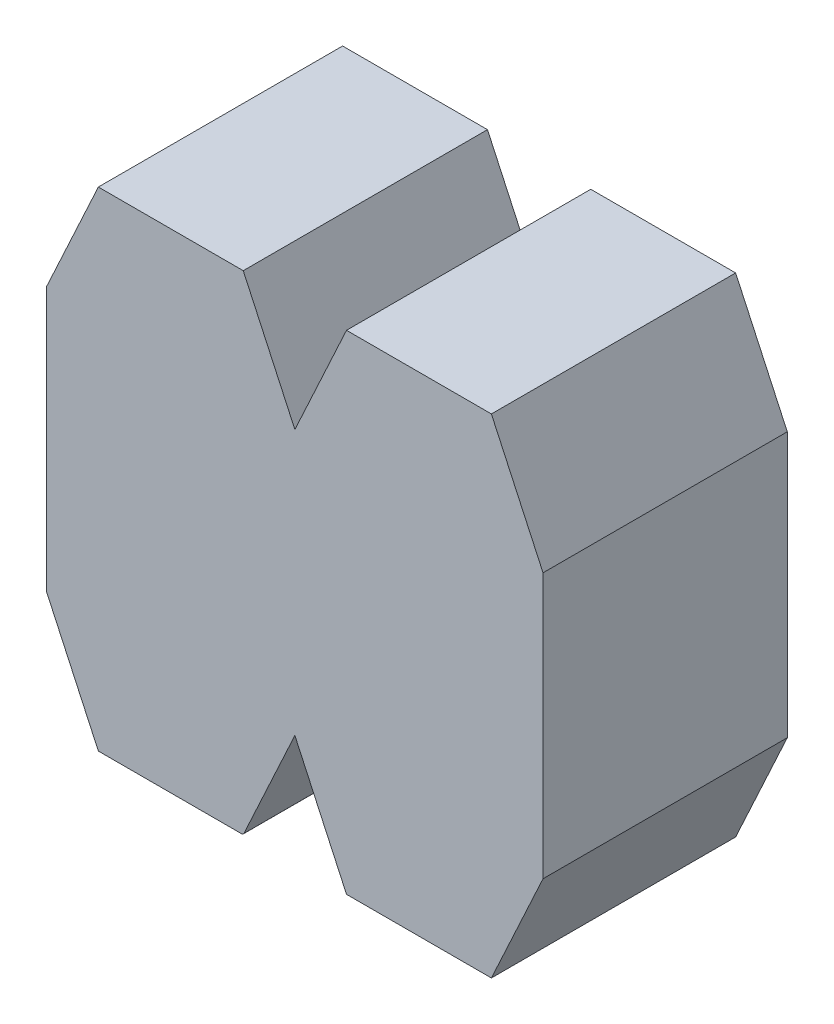
ISO-10303-21;
HEADER;
FILE_DESCRIPTION(('STEP AP214'),'2;1');
FILE_NAME('part.step','',(''),(''),'','','');
FILE_SCHEMA(('AUTOMOTIVE_DESIGN { 1 0 10303 214 1 1 1 1 }'));
ENDSEC;
DATA;
#1=APPLICATION_CONTEXT('core data for automotive mechanical design processes');
#2=APPLICATION_PROTOCOL_DEFINITION('international standard','automotive_design',2000,#1);
#3=PRODUCT_CONTEXT('',#1,'mechanical');
#4=PRODUCT('Part','Part','',(#3));
#5=PRODUCT_RELATED_PRODUCT_CATEGORY('part','',(#4));
#6=PRODUCT_DEFINITION_FORMATION('','',#4);
#7=PRODUCT_DEFINITION_CONTEXT('part definition',#1,'design');
#8=PRODUCT_DEFINITION('design','',#6,#7);
#9=PRODUCT_DEFINITION_SHAPE('','',#8);
#10=(LENGTH_UNIT() NAMED_UNIT(*) SI_UNIT(.MILLI.,.METRE.));
#11=(NAMED_UNIT(*) PLANE_ANGLE_UNIT() SI_UNIT($,.RADIAN.));
#12=(NAMED_UNIT(*) SI_UNIT($,.STERADIAN.) SOLID_ANGLE_UNIT());
#13=UNCERTAINTY_MEASURE_WITH_UNIT(LENGTH_MEASURE(1.E-05),#10,'distance_accuracy_value','');
#14=(GEOMETRIC_REPRESENTATION_CONTEXT(3) GLOBAL_UNCERTAINTY_ASSIGNED_CONTEXT((#13)) GLOBAL_UNIT_ASSIGNED_CONTEXT((#10,
#11,#12)) REPRESENTATION_CONTEXT('',''));
#15=CARTESIAN_POINT('',(0.,0.,0.));
#16=DIRECTION('',(0.,0.,1.));
#17=DIRECTION('',(1.,0.,0.));
#18=AXIS2_PLACEMENT_3D('',#15,#16,#17);
#19=CARTESIAN_POINT('',(-36.2577679754678,28.2576441948346,0.99));
#20=DIRECTION('',(0.907799905305119,0.419403543056108,0.));
#21=DIRECTION('',(-0.419403543056108,0.907799905305119,0.));
#22=AXIS2_PLACEMENT_3D('',#19,#20,#21);
#23=PLANE('',#22);
#24=DIRECTION('',(-0.419403543056108,0.907799905305119,0.));
#25=VECTOR('',#24,1.);
#26=CARTESIAN_POINT('',(-36.2577679754678,28.2576441948346,3.5));
#27=LINE('',#26,#25);
#28=CARTESIAN_POINT('',(-36.7904883959929,29.4107187344124,3.5));
#29=VERTEX_POINT('',#28);
#30=CARTESIAN_POINT('',(-36.2619620108984,28.2667221938878,3.5));
#31=VERTEX_POINT('',#30);
#32=EDGE_CURVE('E118',#29,#31,#27,.F.);
#33=ORIENTED_EDGE('',*,*,#32,.T.);
#34=DIRECTION('',(0.,0.,-1.));
#35=VECTOR('',#34,1.);
#36=CARTESIAN_POINT('',(-36.2619620108984,28.2667221938877,2.25));
#37=LINE('',#36,#35);
#38=CARTESIAN_POINT('',(-36.2619620108984,28.2667221938877,1.));
#39=VERTEX_POINT('',#38);
#40=EDGE_CURVE('E244',#31,#39,#37,.T.);
#41=ORIENTED_EDGE('',*,*,#40,.T.);
#42=DIRECTION('',(-0.419403543056108,0.907799905305119,0.));
#43=VECTOR('',#42,1.);
#44=CARTESIAN_POINT('',(-36.2577679754678,28.2576441948346,1.));
#45=LINE('',#44,#43);
#46=CARTESIAN_POINT('',(-36.7904883959929,29.4107187344124,1.));
#47=VERTEX_POINT('',#46);
#48=EDGE_CURVE('E42',#39,#47,#45,.T.);
#49=ORIENTED_EDGE('',*,*,#48,.T.);
#50=DIRECTION('',(0.,0.,-1.));
#51=VECTOR('',#50,1.);
#52=CARTESIAN_POINT('',(-36.7904883959929,29.4107187344124,2.25));
#53=LINE('',#52,#51);
#54=EDGE_CURVE('E238',#29,#47,#53,.T.);
#55=ORIENTED_EDGE('',*,*,#54,.F.);
#56=EDGE_LOOP('',(#33,#41,#49,#55));
#57=FACE_BOUND('',#56,.T.);
#58=ADVANCED_FACE('F38',(#57),#23,.T.);
#59=CARTESIAN_POINT('',(-36.7804883959929,29.4107187344124,0.99));
#60=DIRECTION('',(0.,1.,0.));
#61=DIRECTION('',(-1.,0.,0.));
#62=AXIS2_PLACEMENT_3D('',#59,#60,#61);
#63=PLANE('',#62);
#64=DIRECTION('',(-1.,0.,0.));
#65=VECTOR('',#64,1.);
#66=CARTESIAN_POINT('',(-36.7804883959929,29.4107187344124,3.5));
#67=LINE('',#66,#65);
#68=CARTESIAN_POINT('',(-38.273435625804,29.4107187344124,3.5));
#69=VERTEX_POINT('',#68);
#70=EDGE_CURVE('E239',#69,#29,#67,.F.);
#71=ORIENTED_EDGE('',*,*,#70,.T.);
#72=ORIENTED_EDGE('',*,*,#54,.T.);
#73=DIRECTION('',(-1.,0.,0.));
#74=VECTOR('',#73,1.);
#75=CARTESIAN_POINT('',(-36.7804883959929,29.4107187344124,1.));
#76=LINE('',#75,#74);
#77=CARTESIAN_POINT('',(-38.273435625804,29.4107187344124,1.));
#78=VERTEX_POINT('',#77);
#79=EDGE_CURVE('E125',#47,#78,#76,.T.);
#80=ORIENTED_EDGE('',*,*,#79,.T.);
#81=DIRECTION('',(0.,0.,-1.));
#82=VECTOR('',#81,1.);
#83=CARTESIAN_POINT('',(-38.273435625804,29.4107187344124,2.25));
#84=LINE('',#83,#82);
#85=EDGE_CURVE('E229',#69,#78,#84,.T.);
#86=ORIENTED_EDGE('',*,*,#85,.F.);
#87=EDGE_LOOP('',(#71,#72,#80,#86));
#88=FACE_BOUND('',#87,.T.);
#89=ADVANCED_FACE('F334',(#88),#63,.T.);
#90=CARTESIAN_POINT('',(-38.2692415903734,29.4197967334655,0.99));
#91=DIRECTION('',(-0.907799905305117,0.419403543056113,0.));
#92=DIRECTION('',(-0.419403543056113,-0.907799905305117,0.));
#93=AXIS2_PLACEMENT_3D('',#90,#91,#92);
#94=PLANE('',#93);
#95=DIRECTION('',(-0.419403543056113,-0.907799905305117,0.));
#96=VECTOR('',#95,1.);
#97=CARTESIAN_POINT('',(-38.2692415903734,29.4197967334655,3.5));
#98=LINE('',#97,#96);
#99=CARTESIAN_POINT('',(-38.8019620108984,28.2667221938877,3.5));
#100=VERTEX_POINT('',#99);
#101=EDGE_CURVE('E230',#100,#69,#98,.F.);
#102=ORIENTED_EDGE('',*,*,#101,.T.);
#103=ORIENTED_EDGE('',*,*,#85,.T.);
#104=DIRECTION('',(-0.419403543056113,-0.907799905305117,0.));
#105=VECTOR('',#104,1.);
#106=CARTESIAN_POINT('',(-38.2692415903734,29.4197967334655,1.));
#107=LINE('',#106,#105);
#108=CARTESIAN_POINT('',(-38.8019620108984,28.2667221938877,1.));
#109=VERTEX_POINT('',#108);
#110=EDGE_CURVE('E234',#78,#109,#107,.T.);
#111=ORIENTED_EDGE('',*,*,#110,.T.);
#112=DIRECTION('',(0.,0.,-1.));
#113=VECTOR('',#112,1.);
#114=CARTESIAN_POINT('',(-38.8019620108984,28.2667221938877,2.25));
#115=LINE('',#114,#113);
#116=EDGE_CURVE('E225',#100,#109,#115,.T.);
#117=ORIENTED_EDGE('',*,*,#116,.F.);
#118=EDGE_LOOP('',(#102,#103,#111,#117));
#119=FACE_BOUND('',#118,.T.);
#120=ADVANCED_FACE('F339',(#119),#94,.T.);
#121=CARTESIAN_POINT('',(-38.7977679754678,28.2576441948346,0.99));
#122=DIRECTION('',(0.907799905305125,0.419403543056095,0.));
#123=DIRECTION('',(-0.419403543056095,0.907799905305125,0.));
#124=AXIS2_PLACEMENT_3D('',#121,#122,#123);
#125=PLANE('',#124);
#126=DIRECTION('',(-0.419403543056095,0.907799905305125,0.));
#127=VECTOR('',#126,1.);
#128=CARTESIAN_POINT('',(-38.7977679754678,28.2576441948346,3.5));
#129=LINE('',#128,#127);
#130=CARTESIAN_POINT('',(-39.3304883959928,29.4107187344124,3.5));
#131=VERTEX_POINT('',#130);
#132=EDGE_CURVE('E221',#131,#100,#129,.F.);
#133=ORIENTED_EDGE('',*,*,#132,.T.);
#134=ORIENTED_EDGE('',*,*,#116,.T.);
#135=DIRECTION('',(-0.419403543056095,0.907799905305125,0.));
#136=VECTOR('',#135,1.);
#137=CARTESIAN_POINT('',(-38.7977679754678,28.2576441948346,1.));
#138=LINE('',#137,#136);
#139=CARTESIAN_POINT('',(-39.3304883959928,29.4107187344124,1.));
#140=VERTEX_POINT('',#139);
#141=EDGE_CURVE('E226',#109,#140,#138,.T.);
#142=ORIENTED_EDGE('',*,*,#141,.T.);
#143=DIRECTION('',(0.,0.,-1.));
#144=VECTOR('',#143,1.);
#145=CARTESIAN_POINT('',(-39.3304883959929,29.4107187344124,2.25));
#146=LINE('',#145,#144);
#147=EDGE_CURVE('E220',#131,#140,#146,.T.);
#148=ORIENTED_EDGE('',*,*,#147,.F.);
#149=EDGE_LOOP('',(#133,#134,#142,#148));
#150=FACE_BOUND('',#149,.T.);
#151=ADVANCED_FACE('F377',(#150),#125,.T.);
#152=CARTESIAN_POINT('',(-39.3204883959929,29.4107187344124,0.99));
#153=DIRECTION('',(0.,1.,0.));
#154=DIRECTION('',(-1.,0.,0.));
#155=AXIS2_PLACEMENT_3D('',#152,#153,#154);
#156=PLANE('',#155);
#157=DIRECTION('',(1.,0.,0.));
#158=VECTOR('',#157,1.);
#159=CARTESIAN_POINT('',(-41.3519620108984,29.4107187344124,3.5));
#160=LINE('',#159,#158);
#161=CARTESIAN_POINT('',(-40.813435625804,29.4107187344124,3.5));
#162=VERTEX_POINT('',#161);
#163=EDGE_CURVE('E187',#131,#162,#160,.F.);
#164=ORIENTED_EDGE('',*,*,#163,.F.);
#165=ORIENTED_EDGE('',*,*,#147,.T.);
#166=DIRECTION('',(-1.,0.,0.));
#167=VECTOR('',#166,1.);
#168=CARTESIAN_POINT('',(9.4680379891016,29.4107187344124,1.));
#169=LINE('',#168,#167);
#170=CARTESIAN_POINT('',(-40.813435625804,29.4107187344124,1.));
#171=VERTEX_POINT('',#170);
#172=EDGE_CURVE('E193',#171,#140,#169,.F.);
#173=ORIENTED_EDGE('',*,*,#172,.F.);
#174=DIRECTION('',(0.,0.,-1.));
#175=VECTOR('',#174,1.);
#176=CARTESIAN_POINT('',(-40.813435625804,29.4107187344124,2.25));
#177=LINE('',#176,#175);
#178=EDGE_CURVE('E268',#162,#171,#177,.T.);
#179=ORIENTED_EDGE('',*,*,#178,.F.);
#180=EDGE_LOOP('',(#164,#165,#173,#179));
#181=FACE_BOUND('',#180,.T.);
#182=ADVANCED_FACE('F374',(#181),#156,.T.);
#183=CARTESIAN_POINT('',(9.4680379891016,24.4007187344124,1.));
#184=DIRECTION('',(0.,0.,-1.));
#185=DIRECTION('',(-1.,0.,0.));
#186=AXIS2_PLACEMENT_3D('',#183,#184,#185);
#187=PLANE('',#186);
#188=DIRECTION('',(0.,-1.,0.));
#189=VECTOR('',#188,1.);
#190=CARTESIAN_POINT('',(-36.2619620108984,25.5547152749371,1.));
#191=LINE('',#190,#189);
#192=CARTESIAN_POINT('',(-36.2619620108984,25.5547152749371,1.));
#193=VERTEX_POINT('',#192);
#194=EDGE_CURVE('E252',#39,#193,#191,.T.);
#195=ORIENTED_EDGE('',*,*,#194,.T.);
#196=DIRECTION('',(-0.419403543056138,-0.907799905305105,0.));
#197=VECTOR('',#196,1.);
#198=CARTESIAN_POINT('',(-36.2619620108983,25.5547152749371,1.));
#199=LINE('',#198,#197);
#200=CARTESIAN_POINT('',(-36.7904883959929,24.4107187344124,1.));
#201=VERTEX_POINT('',#200);
#202=EDGE_CURVE('E216',#193,#201,#199,.T.);
#203=ORIENTED_EDGE('',*,*,#202,.T.);
#204=DIRECTION('',(-1.,0.,0.));
#205=VECTOR('',#204,1.);
#206=CARTESIAN_POINT('',(9.4680379891016,24.4107187344124,1.));
#207=LINE('',#206,#205);
#208=CARTESIAN_POINT('',(-38.2734356258039,24.4107187344124,1.));
#209=VERTEX_POINT('',#208);
#210=EDGE_CURVE('E212',#201,#209,#207,.T.);
#211=ORIENTED_EDGE('',*,*,#210,.T.);
#212=DIRECTION('',(-0.419403543056137,0.907799905305106,0.));
#213=VECTOR('',#212,1.);
#214=CARTESIAN_POINT('',(-38.2734356258039,24.4107187344124,1.));
#215=LINE('',#214,#213);
#216=CARTESIAN_POINT('',(-38.8019620108984,25.5547152749371,1.));
#217=VERTEX_POINT('',#216);
#218=EDGE_CURVE('E208',#209,#217,#215,.T.);
#219=ORIENTED_EDGE('',*,*,#218,.T.);
#220=DIRECTION('',(-0.419403543056157,-0.907799905305096,0.));
#221=VECTOR('',#220,1.);
#222=CARTESIAN_POINT('',(-38.8019620108984,25.5547152749372,1.));
#223=LINE('',#222,#221);
#224=CARTESIAN_POINT('',(-39.3241616420611,24.4244130074228,1.));
#225=VERTEX_POINT('',#224);
#226=EDGE_CURVE('E204',#217,#225,#223,.T.);
#227=ORIENTED_EDGE('',*,*,#226,.T.);
#228=CARTESIAN_POINT('',(-39.1867746556714,24.2790692281209,1.));
#229=DIRECTION('',(0.,0.,-1.));
#230=DIRECTION('',(-1.,0.,0.));
#231=AXIS2_PLACEMENT_3D('',#228,#229,#230);
#232=CIRCLE('',#231,0.199999995527509);
#233=CARTESIAN_POINT('',(-39.3373349615432,24.4107187344124,1.));
#234=VERTEX_POINT('',#233);
#235=EDGE_CURVE('E201',#225,#234,#232,.F.);
#236=ORIENTED_EDGE('',*,*,#235,.T.);
#237=DIRECTION('',(-1.,0.,0.));
#238=VECTOR('',#237,1.);
#239=CARTESIAN_POINT('',(9.4680379891016,24.4107187344124,1.));
#240=LINE('',#239,#238);
#241=CARTESIAN_POINT('',(-40.8134356258039,24.4107187344124,1.));
#242=VERTEX_POINT('',#241);
#243=EDGE_CURVE('E177',#234,#242,#240,.T.);
#244=ORIENTED_EDGE('',*,*,#243,.T.);
#245=DIRECTION('',(-0.419403543056141,0.907799905305104,0.));
#246=VECTOR('',#245,1.);
#247=CARTESIAN_POINT('',(-40.8134356258039,24.4107187344124,1.));
#248=LINE('',#247,#246);
#249=CARTESIAN_POINT('',(-41.3419620108984,25.5547152749371,1.));
#250=VERTEX_POINT('',#249);
#251=EDGE_CURVE('E197',#242,#250,#248,.T.);
#252=ORIENTED_EDGE('',*,*,#251,.T.);
#253=DIRECTION('',(0.,-1.,0.));
#254=VECTOR('',#253,1.);
#255=CARTESIAN_POINT('',(-41.3419620108984,28.2767221938877,1.));
#256=LINE('',#255,#254);
#257=CARTESIAN_POINT('',(-41.3419620108984,28.2667221938877,1.));
#258=VERTEX_POINT('',#257);
#259=EDGE_CURVE('E271',#258,#250,#256,.T.);
#260=ORIENTED_EDGE('',*,*,#259,.F.);
#261=DIRECTION('',(-0.419403543056113,-0.907799905305117,0.));
#262=VECTOR('',#261,1.);
#263=CARTESIAN_POINT('',(-40.8092415903734,29.4197967334655,1.));
#264=LINE('',#263,#262);
#265=EDGE_CURVE('E307',#171,#258,#264,.T.);
#266=ORIENTED_EDGE('',*,*,#265,.F.);
#267=ORIENTED_EDGE('',*,*,#172,.T.);
#268=ORIENTED_EDGE('',*,*,#141,.F.);
#269=ORIENTED_EDGE('',*,*,#110,.F.);
#270=ORIENTED_EDGE('',*,*,#79,.F.);
#271=ORIENTED_EDGE('',*,*,#48,.F.);
#272=EDGE_LOOP('',(#195,#203,#211,#219,#227,#236,#244,#252,#260,#266,#267,#268,#269,#270,#271));
#273=FACE_BOUND('',#272,.T.);
#274=ADVANCED_FACE('F326',(#273),#187,.T.);
#275=CARTESIAN_POINT('',(-41.3519620108984,24.4007187344124,3.5));
#276=DIRECTION('',(0.,0.,1.));
#277=DIRECTION('',(1.,0.,0.));
#278=AXIS2_PLACEMENT_3D('',#275,#276,#277);
#279=PLANE('',#278);
#280=DIRECTION('',(0.,-1.,0.));
#281=VECTOR('',#280,1.);
#282=CARTESIAN_POINT('',(-36.2619620108984,25.5547152749371,3.5));
#283=LINE('',#282,#281);
#284=CARTESIAN_POINT('',(-36.2619620108984,25.5547152749371,3.5));
#285=VERTEX_POINT('',#284);
#286=EDGE_CURVE('E255',#31,#285,#283,.T.);
#287=ORIENTED_EDGE('',*,*,#286,.F.);
#288=ORIENTED_EDGE('',*,*,#32,.F.);
#289=ORIENTED_EDGE('',*,*,#70,.F.);
#290=ORIENTED_EDGE('',*,*,#101,.F.);
#291=ORIENTED_EDGE('',*,*,#132,.F.);
#292=ORIENTED_EDGE('',*,*,#163,.T.);
#293=DIRECTION('',(-0.419403543056113,-0.907799905305117,0.));
#294=VECTOR('',#293,1.);
#295=CARTESIAN_POINT('',(-40.8092415903734,29.4197967334655,3.5));
#296=LINE('',#295,#294);
#297=CARTESIAN_POINT('',(-41.3419620108984,28.2667221938877,3.5));
#298=VERTEX_POINT('',#297);
#299=EDGE_CURVE('E272',#298,#162,#296,.F.);
#300=ORIENTED_EDGE('',*,*,#299,.F.);
#301=DIRECTION('',(0.,-1.,0.));
#302=VECTOR('',#301,1.);
#303=CARTESIAN_POINT('',(-41.3419620108984,28.2767221938877,3.5));
#304=LINE('',#303,#302);
#305=CARTESIAN_POINT('',(-41.3419620108984,25.5547152749371,3.5));
#306=VERTEX_POINT('',#305);
#307=EDGE_CURVE('E267',#306,#298,#304,.F.);
#308=ORIENTED_EDGE('',*,*,#307,.F.);
#309=DIRECTION('',(0.419403543056147,-0.907799905305101,0.));
#310=VECTOR('',#309,1.);
#311=CARTESIAN_POINT('',(-41.3419620108985,25.5547152749372,3.5));
#312=LINE('',#311,#310);
#313=CARTESIAN_POINT('',(-40.8134356258039,24.4107187344124,3.5));
#314=VERTEX_POINT('',#313);
#315=EDGE_CURVE('E58',#306,#314,#312,.T.);
#316=ORIENTED_EDGE('',*,*,#315,.T.);
#317=DIRECTION('',(1.,0.,0.));
#318=VECTOR('',#317,1.);
#319=CARTESIAN_POINT('',(-41.3519620108984,24.4107187344124,3.5));
#320=LINE('',#319,#318);
#321=CARTESIAN_POINT('',(-39.3373349615432,24.4107187344124,3.5));
#322=VERTEX_POINT('',#321);
#323=EDGE_CURVE('E171',#314,#322,#320,.T.);
#324=ORIENTED_EDGE('',*,*,#323,.T.);
#325=CARTESIAN_POINT('',(-39.1867746556714,24.2790692281209,3.5));
#326=DIRECTION('',(0.,0.,1.));
#327=DIRECTION('',(1.,0.,0.));
#328=AXIS2_PLACEMENT_3D('',#325,#326,#327);
#329=CIRCLE('',#328,0.199999995527509);
#330=CARTESIAN_POINT('',(-39.3241616420611,24.4244130074228,3.5));
#331=VERTEX_POINT('',#330);
#332=EDGE_CURVE('E163',#322,#331,#329,.F.);
#333=ORIENTED_EDGE('',*,*,#332,.T.);
#334=DIRECTION('',(0.419403543056149,0.9077999053051,0.));
#335=VECTOR('',#334,1.);
#336=CARTESIAN_POINT('',(-39.3241616420611,24.4244130074228,3.5));
#337=LINE('',#336,#335);
#338=CARTESIAN_POINT('',(-38.8019620108984,25.5547152749371,3.5));
#339=VERTEX_POINT('',#338);
#340=EDGE_CURVE('E157',#331,#339,#337,.T.);
#341=ORIENTED_EDGE('',*,*,#340,.T.);
#342=DIRECTION('',(0.419403543056143,-0.907799905305103,0.));
#343=VECTOR('',#342,1.);
#344=CARTESIAN_POINT('',(-38.8019620108984,25.5547152749371,3.5));
#345=LINE('',#344,#343);
#346=CARTESIAN_POINT('',(-38.2734356258039,24.4107187344124,3.5));
#347=VERTEX_POINT('',#346);
#348=EDGE_CURVE('E319',#339,#347,#345,.T.);
#349=ORIENTED_EDGE('',*,*,#348,.T.);
#350=DIRECTION('',(1.,0.,0.));
#351=VECTOR('',#350,1.);
#352=CARTESIAN_POINT('',(-41.3519620108984,24.4107187344124,3.5));
#353=LINE('',#352,#351);
#354=CARTESIAN_POINT('',(-36.7904883959929,24.4107187344124,3.5));
#355=VERTEX_POINT('',#354);
#356=EDGE_CURVE('E315',#347,#355,#353,.T.);
#357=ORIENTED_EDGE('',*,*,#356,.T.);
#358=DIRECTION('',(0.419403543056137,0.907799905305106,0.));
#359=VECTOR('',#358,1.);
#360=CARTESIAN_POINT('',(-36.7904883959929,24.4107187344124,3.5));
#361=LINE('',#360,#359);
#362=EDGE_CURVE('E311',#355,#285,#361,.T.);
#363=ORIENTED_EDGE('',*,*,#362,.T.);
#364=EDGE_LOOP('',(#287,#288,#289,#290,#291,#292,#300,#308,#316,#324,#333,#341,#349,#357,#363));
#365=FACE_BOUND('',#364,.T.);
#366=ADVANCED_FACE('F181',(#365),#279,.T.);
#367=CARTESIAN_POINT('',(-40.8092415903734,29.4197967334655,0.99));
#368=DIRECTION('',(-0.907799905305117,0.419403543056113,0.));
#369=DIRECTION('',(-0.419403543056113,-0.907799905305117,0.));
#370=AXIS2_PLACEMENT_3D('',#367,#368,#369);
#371=PLANE('',#370);
#372=ORIENTED_EDGE('',*,*,#299,.T.);
#373=ORIENTED_EDGE('',*,*,#178,.T.);
#374=ORIENTED_EDGE('',*,*,#265,.T.);
#375=DIRECTION('',(0.,0.,-1.));
#376=VECTOR('',#375,1.);
#377=CARTESIAN_POINT('',(-41.3419620108984,28.2667221938877,2.25));
#378=LINE('',#377,#376);
#379=EDGE_CURVE('E263',#298,#258,#378,.T.);
#380=ORIENTED_EDGE('',*,*,#379,.F.);
#381=EDGE_LOOP('',(#372,#373,#374,#380));
#382=FACE_BOUND('',#381,.T.);
#383=ADVANCED_FACE('F365',(#382),#371,.T.);
#384=CARTESIAN_POINT('',(-41.3419620108984,28.2767221938877,0.99));
#385=DIRECTION('',(-1.,0.,0.));
#386=DIRECTION('',(0.,-1.,0.));
#387=AXIS2_PLACEMENT_3D('',#384,#385,#386);
#388=PLANE('',#387);
#389=ORIENTED_EDGE('',*,*,#307,.T.);
#390=ORIENTED_EDGE('',*,*,#379,.T.);
#391=ORIENTED_EDGE('',*,*,#259,.T.);
#392=DIRECTION('',(0.,0.,-1.));
#393=VECTOR('',#392,1.);
#394=CARTESIAN_POINT('',(-41.3419620108984,25.5547152749372,2.25));
#395=LINE('',#394,#393);
#396=EDGE_CURVE('E260',#306,#250,#395,.T.);
#397=ORIENTED_EDGE('',*,*,#396,.F.);
#398=EDGE_LOOP('',(#389,#390,#391,#397));
#399=FACE_BOUND('',#398,.T.);
#400=ADVANCED_FACE('F362',(#399),#388,.T.);
#401=CARTESIAN_POINT('',(-41.346156046329,25.5637932739902,0.99));
#402=DIRECTION('',(-0.907799905305103,-0.419403543056143,0.));
#403=DIRECTION('',(0.419403543056143,-0.907799905305103,0.));
#404=AXIS2_PLACEMENT_3D('',#401,#402,#403);
#405=PLANE('',#404);
#406=ORIENTED_EDGE('',*,*,#315,.F.);
#407=ORIENTED_EDGE('',*,*,#396,.T.);
#408=ORIENTED_EDGE('',*,*,#251,.F.);
#409=DIRECTION('',(0.,0.,-1.));
#410=VECTOR('',#409,1.);
#411=CARTESIAN_POINT('',(-40.8134356258039,24.4107187344124,2.25));
#412=LINE('',#411,#410);
#413=EDGE_CURVE('E179',#314,#242,#412,.T.);
#414=ORIENTED_EDGE('',*,*,#413,.F.);
#415=EDGE_LOOP('',(#406,#407,#408,#414));
#416=FACE_BOUND('',#415,.T.);
#417=ADVANCED_FACE('F359',(#416),#405,.T.);
#418=CARTESIAN_POINT('',(-40.823435625804,24.4107187344124,0.99));
#419=DIRECTION('',(0.,-1.,0.));
#420=DIRECTION('',(1.,0.,0.));
#421=AXIS2_PLACEMENT_3D('',#418,#419,#420);
#422=PLANE('',#421);
#423=ORIENTED_EDGE('',*,*,#323,.F.);
#424=ORIENTED_EDGE('',*,*,#413,.T.);
#425=ORIENTED_EDGE('',*,*,#243,.F.);
#426=DIRECTION('',(0.,0.,-1.));
#427=VECTOR('',#426,1.);
#428=CARTESIAN_POINT('',(-39.3373349615432,24.4107187344124,2.25));
#429=LINE('',#428,#427);
#430=EDGE_CURVE('E166',#322,#234,#429,.T.);
#431=ORIENTED_EDGE('',*,*,#430,.F.);
#432=EDGE_LOOP('',(#423,#424,#425,#431));
#433=FACE_BOUND('',#432,.T.);
#434=ADVANCED_FACE('F174',(#433),#422,.T.);
#435=CARTESIAN_POINT('',(-39.1867746556714,24.2790692281209,1.));
#436=DIRECTION('',(0.,0.,1.));
#437=DIRECTION('',(1.,0.,0.));
#438=AXIS2_PLACEMENT_3D('',#435,#436,#437);
#439=CYLINDRICAL_SURFACE('',#438,0.199999995527509);
#440=ORIENTED_EDGE('',*,*,#332,.F.);
#441=ORIENTED_EDGE('',*,*,#430,.T.);
#442=ORIENTED_EDGE('',*,*,#235,.F.);
#443=DIRECTION('',(0.,0.,-1.));
#444=VECTOR('',#443,1.);
#445=CARTESIAN_POINT('',(-39.3241616420611,24.4244130074228,2.25));
#446=LINE('',#445,#444);
#447=EDGE_CURVE('E168',#331,#225,#446,.T.);
#448=ORIENTED_EDGE('',*,*,#447,.F.);
#449=EDGE_LOOP('',(#440,#441,#442,#448));
#450=FACE_BOUND('',#449,.T.);
#451=ADVANCED_FACE('F165',(#450),#439,.F.);
#452=CARTESIAN_POINT('',(-39.3283556774917,24.4153350083697,0.99));
#453=DIRECTION('',(0.9077999053051,-0.419403543056149,0.));
#454=DIRECTION('',(0.419403543056149,0.9077999053051,0.));
#455=AXIS2_PLACEMENT_3D('',#452,#453,#454);
#456=PLANE('',#455);
#457=ORIENTED_EDGE('',*,*,#340,.F.);
#458=ORIENTED_EDGE('',*,*,#447,.T.);
#459=ORIENTED_EDGE('',*,*,#226,.F.);
#460=DIRECTION('',(0.,0.,-1.));
#461=VECTOR('',#460,1.);
#462=CARTESIAN_POINT('',(-38.8019620108985,25.5547152749372,2.25));
#463=LINE('',#462,#461);
#464=EDGE_CURVE('E280',#339,#217,#463,.T.);
#465=ORIENTED_EDGE('',*,*,#464,.F.);
#466=EDGE_LOOP('',(#457,#458,#459,#465));
#467=FACE_BOUND('',#466,.T.);
#468=ADVANCED_FACE('F325',(#467),#456,.T.);
#469=CARTESIAN_POINT('',(-38.806156046329,25.5637932739902,0.99));
#470=DIRECTION('',(-0.907799905305103,-0.419403543056143,0.));
#471=DIRECTION('',(0.419403543056143,-0.907799905305103,0.));
#472=AXIS2_PLACEMENT_3D('',#469,#470,#471);
#473=PLANE('',#472);
#474=ORIENTED_EDGE('',*,*,#348,.F.);
#475=ORIENTED_EDGE('',*,*,#464,.T.);
#476=ORIENTED_EDGE('',*,*,#218,.F.);
#477=DIRECTION('',(0.,0.,-1.));
#478=VECTOR('',#477,1.);
#479=CARTESIAN_POINT('',(-38.2734356258039,24.4107187344124,2.25));
#480=LINE('',#479,#478);
#481=EDGE_CURVE('E277',#347,#209,#480,.T.);
#482=ORIENTED_EDGE('',*,*,#481,.F.);
#483=EDGE_LOOP('',(#474,#475,#476,#482));
#484=FACE_BOUND('',#483,.T.);
#485=ADVANCED_FACE('F324',(#484),#473,.T.);
#486=CARTESIAN_POINT('',(-38.2834356258039,24.4107187344124,0.99));
#487=DIRECTION('',(0.,-1.,0.));
#488=DIRECTION('',(1.,0.,0.));
#489=AXIS2_PLACEMENT_3D('',#486,#487,#488);
#490=PLANE('',#489);
#491=ORIENTED_EDGE('',*,*,#356,.F.);
#492=ORIENTED_EDGE('',*,*,#481,.T.);
#493=ORIENTED_EDGE('',*,*,#210,.F.);
#494=DIRECTION('',(0.,0.,-1.));
#495=VECTOR('',#494,1.);
#496=CARTESIAN_POINT('',(-36.7904883959929,24.4107187344124,2.25));
#497=LINE('',#496,#495);
#498=EDGE_CURVE('E49',#355,#201,#497,.T.);
#499=ORIENTED_EDGE('',*,*,#498,.F.);
#500=EDGE_LOOP('',(#491,#492,#493,#499));
#501=FACE_BOUND('',#500,.T.);
#502=ADVANCED_FACE('F328',(#501),#490,.T.);
#503=CARTESIAN_POINT('',(-36.7946824314234,24.4016407353594,0.99));
#504=DIRECTION('',(0.907799905305105,-0.419403543056138,0.));
#505=DIRECTION('',(0.419403543056138,0.907799905305105,0.));
#506=AXIS2_PLACEMENT_3D('',#503,#504,#505);
#507=PLANE('',#506);
#508=ORIENTED_EDGE('',*,*,#362,.F.);
#509=ORIENTED_EDGE('',*,*,#498,.T.);
#510=ORIENTED_EDGE('',*,*,#202,.F.);
#511=DIRECTION('',(0.,0.,-1.));
#512=VECTOR('',#511,1.);
#513=CARTESIAN_POINT('',(-36.2619620108985,25.5547152749372,2.25));
#514=LINE('',#513,#512);
#515=EDGE_CURVE('E11',#285,#193,#514,.T.);
#516=ORIENTED_EDGE('',*,*,#515,.F.);
#517=EDGE_LOOP('',(#508,#509,#510,#516));
#518=FACE_BOUND('',#517,.T.);
#519=ADVANCED_FACE('F40',(#518),#507,.T.);
#520=CARTESIAN_POINT('',(-36.2619620108984,25.5547152749371,-44.9925907076347));
#521=DIRECTION('',(-1.,0.,0.));
#522=DIRECTION('',(0.,0.,1.));
#523=AXIS2_PLACEMENT_3D('',#520,#521,#522);
#524=PLANE('',#523);
#525=ORIENTED_EDGE('',*,*,#40,.F.);
#526=ORIENTED_EDGE('',*,*,#286,.T.);
#527=ORIENTED_EDGE('',*,*,#515,.T.);
#528=ORIENTED_EDGE('',*,*,#194,.F.);
#529=EDGE_LOOP('',(#525,#526,#527,#528));
#530=FACE_BOUND('',#529,.T.);
#531=ADVANCED_FACE('F332',(#530),#524,.F.);
#532=CLOSED_SHELL('',(#58,#89,#120,#151,#182,#274,#366,#383,#400,#417,#434,#451,#468,#485,#502,
#519,#531));
#533=MANIFOLD_SOLID_BREP('B2',#532);
#534=ADVANCED_BREP_SHAPE_REPRESENTATION('',(#18,#533),#14);
#535=SHAPE_DEFINITION_REPRESENTATION(#9,#534);
ENDSEC;
END-ISO-10303-21;
